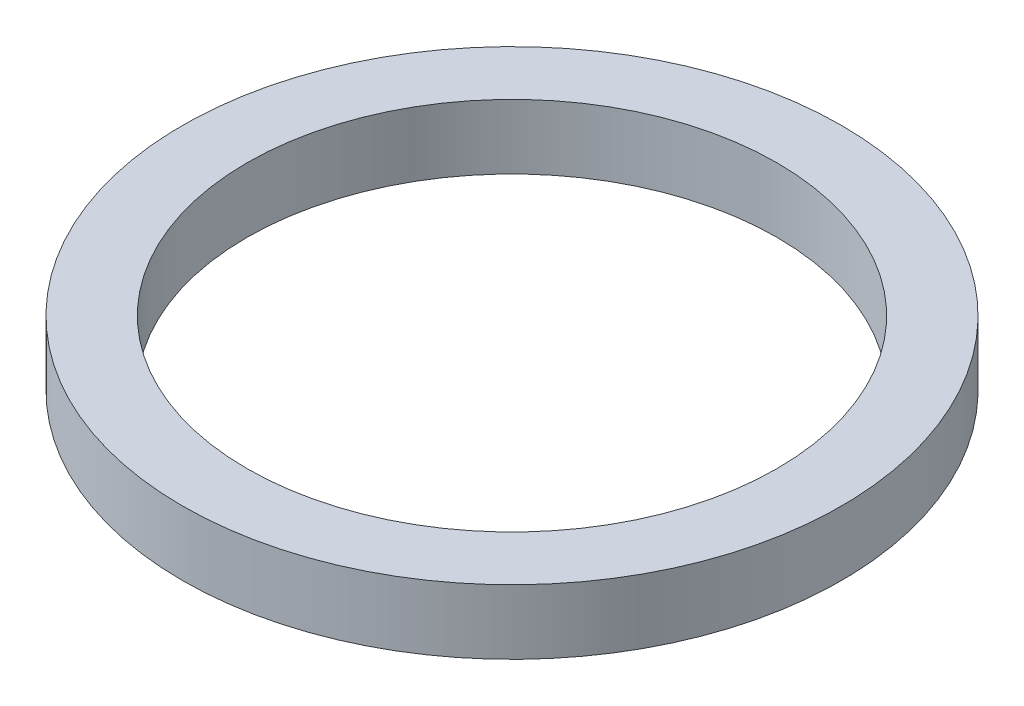
ISO-10303-21;
HEADER;
FILE_DESCRIPTION(('STEP AP214'),'2;1');
FILE_NAME('part.step','',(''),(''),'','','');
FILE_SCHEMA(('AUTOMOTIVE_DESIGN { 1 0 10303 214 1 1 1 1 }'));
ENDSEC;
DATA;
#1=APPLICATION_CONTEXT('core data for automotive mechanical design processes');
#2=APPLICATION_PROTOCOL_DEFINITION('international standard','automotive_design',2000,#1);
#3=PRODUCT_CONTEXT('',#1,'mechanical');
#4=PRODUCT('Part','Part','',(#3));
#5=PRODUCT_RELATED_PRODUCT_CATEGORY('part','',(#4));
#6=PRODUCT_DEFINITION_FORMATION('','',#4);
#7=PRODUCT_DEFINITION_CONTEXT('part definition',#1,'design');
#8=PRODUCT_DEFINITION('design','',#6,#7);
#9=PRODUCT_DEFINITION_SHAPE('','',#8);
#10=(LENGTH_UNIT() NAMED_UNIT(*) SI_UNIT(.MILLI.,.METRE.));
#11=(NAMED_UNIT(*) PLANE_ANGLE_UNIT() SI_UNIT($,.RADIAN.));
#12=(NAMED_UNIT(*) SI_UNIT($,.STERADIAN.) SOLID_ANGLE_UNIT());
#13=UNCERTAINTY_MEASURE_WITH_UNIT(LENGTH_MEASURE(1.E-05),#10,'distance_accuracy_value','');
#14=(GEOMETRIC_REPRESENTATION_CONTEXT(3) GLOBAL_UNCERTAINTY_ASSIGNED_CONTEXT((#13)) GLOBAL_UNIT_ASSIGNED_CONTEXT((#10,
#11,#12)) REPRESENTATION_CONTEXT('',''));
#15=CARTESIAN_POINT('',(0.,0.,0.));
#16=DIRECTION('',(0.,0.,1.));
#17=DIRECTION('',(1.,0.,0.));
#18=AXIS2_PLACEMENT_3D('',#15,#16,#17);
#19=CARTESIAN_POINT('',(0.,2.5,0.));
#20=DIRECTION('',(0.,1.,0.));
#21=DIRECTION('',(0.,0.,1.));
#22=AXIS2_PLACEMENT_3D('',#19,#20,#21);
#23=PLANE('',#22);
#24=CARTESIAN_POINT('',(0.,2.5,0.));
#25=DIRECTION('',(0.,1.,0.));
#26=DIRECTION('',(0.,0.,1.));
#27=AXIS2_PLACEMENT_3D('',#24,#25,#26);
#28=CIRCLE('',#27,12.75);
#29=CARTESIAN_POINT('',(0.,2.5,12.75));
#30=VERTEX_POINT('',#29);
#31=EDGE_CURVE('E10',#30,#30,#28,.T.);
#32=ORIENTED_EDGE('',*,*,#31,.T.);
#33=EDGE_LOOP('',(#32));
#34=FACE_BOUND('',#33,.T.);
#35=CARTESIAN_POINT('',(0.,2.5,0.));
#36=DIRECTION('',(0.,1.,0.));
#37=DIRECTION('',(0.,0.,1.));
#38=AXIS2_PLACEMENT_3D('',#35,#36,#37);
#39=CIRCLE('',#38,10.25);
#40=CARTESIAN_POINT('',(0.,2.5,10.25));
#41=VERTEX_POINT('',#40);
#42=EDGE_CURVE('E48',#41,#41,#39,.T.);
#43=ORIENTED_EDGE('',*,*,#42,.F.);
#44=EDGE_LOOP('',(#43));
#45=FACE_BOUND('',#44,.T.);
#46=ADVANCED_FACE('F37',(#34,#45),#23,.T.);
#47=CARTESIAN_POINT('',(0.,0.,0.));
#48=DIRECTION('',(0.,1.,0.));
#49=DIRECTION('',(0.,0.,1.));
#50=AXIS2_PLACEMENT_3D('',#47,#48,#49);
#51=PLANE('',#50);
#52=CARTESIAN_POINT('',(0.,0.,0.));
#53=DIRECTION('',(0.,1.,0.));
#54=DIRECTION('',(0.,0.,1.));
#55=AXIS2_PLACEMENT_3D('',#52,#53,#54);
#56=CIRCLE('',#55,12.75);
#57=CARTESIAN_POINT('',(0.,0.,12.75));
#58=VERTEX_POINT('',#57);
#59=EDGE_CURVE('E41',#58,#58,#56,.T.);
#60=ORIENTED_EDGE('',*,*,#59,.F.);
#61=EDGE_LOOP('',(#60));
#62=FACE_BOUND('',#61,.T.);
#63=CARTESIAN_POINT('',(0.,0.,0.));
#64=DIRECTION('',(0.,1.,0.));
#65=DIRECTION('',(0.,0.,1.));
#66=AXIS2_PLACEMENT_3D('',#63,#64,#65);
#67=CIRCLE('',#66,10.25);
#68=CARTESIAN_POINT('',(0.,0.,10.25));
#69=VERTEX_POINT('',#68);
#70=EDGE_CURVE('E50',#69,#69,#67,.T.);
#71=ORIENTED_EDGE('',*,*,#70,.T.);
#72=EDGE_LOOP('',(#71));
#73=FACE_BOUND('',#72,.T.);
#74=ADVANCED_FACE('F60',(#62,#73),#51,.F.);
#75=CARTESIAN_POINT('',(0.,2.5,0.));
#76=DIRECTION('',(0.,-1.,0.));
#77=DIRECTION('',(0.,0.,-1.));
#78=AXIS2_PLACEMENT_3D('',#75,#76,#77);
#79=CYLINDRICAL_SURFACE('',#78,12.75);
#80=ORIENTED_EDGE('',*,*,#31,.F.);
#81=EDGE_LOOP('',(#80));
#82=FACE_BOUND('',#81,.T.);
#83=ORIENTED_EDGE('',*,*,#59,.T.);
#84=EDGE_LOOP('',(#83));
#85=FACE_BOUND('',#84,.T.);
#86=ADVANCED_FACE('F39',(#82,#85),#79,.T.);
#87=CARTESIAN_POINT('',(0.,2.5,0.));
#88=DIRECTION('',(0.,-1.,0.));
#89=DIRECTION('',(0.,0.,-1.));
#90=AXIS2_PLACEMENT_3D('',#87,#88,#89);
#91=CYLINDRICAL_SURFACE('',#90,10.25);
#92=ORIENTED_EDGE('',*,*,#42,.T.);
#93=EDGE_LOOP('',(#92));
#94=FACE_BOUND('',#93,.T.);
#95=ORIENTED_EDGE('',*,*,#70,.F.);
#96=EDGE_LOOP('',(#95));
#97=FACE_BOUND('',#96,.T.);
#98=ADVANCED_FACE('F56',(#94,#97),#91,.F.);
#99=CLOSED_SHELL('',(#46,#74,#86,#98));
#100=MANIFOLD_SOLID_BREP('B2',#99);
#101=ADVANCED_BREP_SHAPE_REPRESENTATION('',(#18,#100),#14);
#102=SHAPE_DEFINITION_REPRESENTATION(#9,#101);
ENDSEC;
END-ISO-10303-21;
